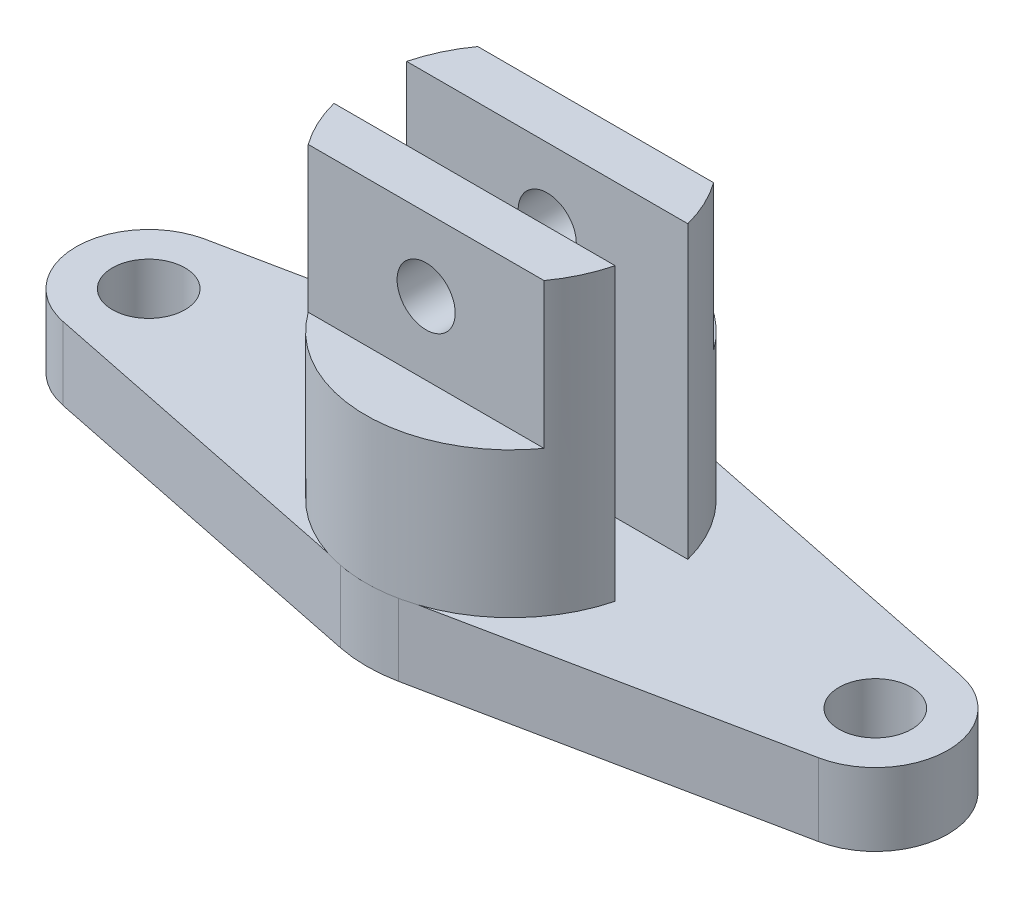
ISO-10303-21;
HEADER;
FILE_DESCRIPTION(('STEP AP214'),'2;1');
FILE_NAME('part.step','',(''),(''),'','','');
FILE_SCHEMA(('AUTOMOTIVE_DESIGN { 1 0 10303 214 1 1 1 1 }'));
ENDSEC;
DATA;
#1=APPLICATION_CONTEXT('core data for automotive mechanical design processes');
#2=APPLICATION_PROTOCOL_DEFINITION('international standard','automotive_design',2000,#1);
#3=PRODUCT_CONTEXT('',#1,'mechanical');
#4=PRODUCT('Part','Part','',(#3));
#5=PRODUCT_RELATED_PRODUCT_CATEGORY('part','',(#4));
#6=PRODUCT_DEFINITION_FORMATION('','',#4);
#7=PRODUCT_DEFINITION_CONTEXT('part definition',#1,'design');
#8=PRODUCT_DEFINITION('design','',#6,#7);
#9=PRODUCT_DEFINITION_SHAPE('','',#8);
#10=(LENGTH_UNIT() NAMED_UNIT(*) SI_UNIT(.MILLI.,.METRE.));
#11=(NAMED_UNIT(*) PLANE_ANGLE_UNIT() SI_UNIT($,.RADIAN.));
#12=(NAMED_UNIT(*) SI_UNIT($,.STERADIAN.) SOLID_ANGLE_UNIT());
#13=UNCERTAINTY_MEASURE_WITH_UNIT(LENGTH_MEASURE(1.E-05),#10,'distance_accuracy_value','');
#14=(GEOMETRIC_REPRESENTATION_CONTEXT(3) GLOBAL_UNCERTAINTY_ASSIGNED_CONTEXT((#13)) GLOBAL_UNIT_ASSIGNED_CONTEXT((#10,
#11,#12)) REPRESENTATION_CONTEXT('',''));
#15=CARTESIAN_POINT('',(0.,0.,0.));
#16=DIRECTION('',(0.,0.,1.));
#17=DIRECTION('',(1.,0.,0.));
#18=AXIS2_PLACEMENT_3D('',#15,#16,#17);
#19=CARTESIAN_POINT('',(-75.,15.,-0.225353750431825));
#20=DIRECTION('',(0.,1.,0.));
#21=DIRECTION('',(0.,0.,1.));
#22=AXIS2_PLACEMENT_3D('',#19,#20,#21);
#23=PLANE('',#22);
#24=CARTESIAN_POINT('',(-75.,15.,-0.225353750431825));
#25=DIRECTION('',(0.,1.,0.));
#26=DIRECTION('',(0.,0.,1.));
#27=AXIS2_PLACEMENT_3D('',#24,#25,#26);
#28=CIRCLE('',#27,7.5);
#29=CARTESIAN_POINT('',(-75.,15.,7.27464624956817));
#30=VERTEX_POINT('',#29);
#31=EDGE_CURVE('E323',#30,#30,#28,.T.);
#32=ORIENTED_EDGE('',*,*,#31,.F.);
#33=EDGE_LOOP('',(#32));
#34=FACE_BOUND('',#33,.T.);
#35=CARTESIAN_POINT('',(75.,15.,-0.225353750431825));
#36=DIRECTION('',(0.,1.,0.));
#37=DIRECTION('',(0.,0.,1.));
#38=AXIS2_PLACEMENT_3D('',#35,#36,#37);
#39=CIRCLE('',#38,7.5);
#40=CARTESIAN_POINT('',(75.,15.,7.27464624956817));
#41=VERTEX_POINT('',#40);
#42=EDGE_CURVE('E330',#41,#41,#39,.T.);
#43=ORIENTED_EDGE('',*,*,#42,.F.);
#44=EDGE_LOOP('',(#43));
#45=FACE_BOUND('',#44,.T.);
#46=DIRECTION('',(1.,0.,0.));
#47=VECTOR('',#46,1.);
#48=CARTESIAN_POINT('',(-29.0232994640735,15.,-7.5));
#49=LINE('',#48,#47);
#50=CARTESIAN_POINT('',(-29.0232994640735,15.,-7.5));
#51=VERTEX_POINT('',#50);
#52=CARTESIAN_POINT('',(29.0232994640735,15.,-7.5));
#53=VERTEX_POINT('',#52);
#54=EDGE_CURVE('E216',#51,#53,#49,.T.);
#55=ORIENTED_EDGE('',*,*,#54,.F.);
#56=CARTESIAN_POINT('',(0.,15.,0.));
#57=DIRECTION('',(0.,1.,0.));
#58=DIRECTION('',(0.,0.,1.));
#59=AXIS2_PLACEMENT_3D('',#56,#57,#58);
#60=CIRCLE('',#59,29.976689473344);
#61=EDGE_CURVE('E203',#53,#51,#60,.T.);
#62=ORIENTED_EDGE('',*,*,#61,.F.);
#63=EDGE_LOOP('',(#55,#62));
#64=FACE_BOUND('',#63,.T.);
#65=DIRECTION('',(0.979795897113271,0.,0.2));
#66=VECTOR('',#65,1.);
#67=CARTESIAN_POINT('',(-78.,15.,14.4715847062672));
#68=LINE('',#67,#66);
#69=CARTESIAN_POINT('',(-78.,15.,14.4715847062672));
#70=VERTEX_POINT('',#69);
#71=CARTESIAN_POINT('',(-9.32172038169414,15.,28.4904798293535));
#72=VERTEX_POINT('',#71);
#73=EDGE_CURVE('E231',#70,#72,#68,.T.);
#74=ORIENTED_EDGE('',*,*,#73,.T.);
#75=CARTESIAN_POINT('',(0.,15.,0.));
#76=DIRECTION('',(0.,1.,0.));
#77=DIRECTION('',(0.,0.,1.));
#78=AXIS2_PLACEMENT_3D('',#75,#76,#77);
#79=CIRCLE('',#78,29.976689473344);
#80=CARTESIAN_POINT('',(-29.0232994640735,15.,7.5));
#81=VERTEX_POINT('',#80);
#82=EDGE_CURVE('E204',#81,#72,#79,.T.);
#83=ORIENTED_EDGE('',*,*,#82,.F.);
#84=DIRECTION('',(-1.,0.,0.));
#85=VECTOR('',#84,1.);
#86=CARTESIAN_POINT('',(-29.0232994640735,15.,7.5));
#87=LINE('',#86,#85);
#88=CARTESIAN_POINT('',(29.0232994640735,15.,7.5));
#89=VERTEX_POINT('',#88);
#90=EDGE_CURVE('E188',#89,#81,#87,.T.);
#91=ORIENTED_EDGE('',*,*,#90,.F.);
#92=CARTESIAN_POINT('',(9.32172038169412,15.,28.4904798293535));
#93=VERTEX_POINT('',#92);
#94=EDGE_CURVE('E194',#93,#89,#79,.T.);
#95=ORIENTED_EDGE('',*,*,#94,.F.);
#96=DIRECTION('',(0.979795897113271,0.,-0.2));
#97=VECTOR('',#96,1.);
#98=CARTESIAN_POINT('',(78.,15.,14.4715847062672));
#99=LINE('',#98,#97);
#100=CARTESIAN_POINT('',(78.,15.,14.4715847062672));
#101=VERTEX_POINT('',#100);
#102=EDGE_CURVE('E240',#93,#101,#99,.T.);
#103=ORIENTED_EDGE('',*,*,#102,.T.);
#104=CARTESIAN_POINT('',(75.,15.,-0.225353750431825));
#105=DIRECTION('',(0.,1.,0.));
#106=DIRECTION('',(0.,0.,-1.));
#107=AXIS2_PLACEMENT_3D('',#104,#105,#106);
#108=CIRCLE('',#107,15.);
#109=CARTESIAN_POINT('',(78.,15.,-14.9222922071309));
#110=VERTEX_POINT('',#109);
#111=EDGE_CURVE('E245',#101,#110,#108,.T.);
#112=ORIENTED_EDGE('',*,*,#111,.T.);
#113=DIRECTION('',(-0.979795897113271,0.,-0.2));
#114=VECTOR('',#113,1.);
#115=CARTESIAN_POINT('',(78.,15.,-14.9222922071309));
#116=LINE('',#115,#114);
#117=CARTESIAN_POINT('',(6.00000000000001,15.,-29.61923066383));
#118=VERTEX_POINT('',#117);
#119=EDGE_CURVE('E248',#110,#118,#116,.T.);
#120=ORIENTED_EDGE('',*,*,#119,.T.);
#121=CARTESIAN_POINT('',(0.,15.,-0.225353750431825));
#122=DIRECTION('',(0.,1.,0.));
#123=DIRECTION('',(0.,0.,1.));
#124=AXIS2_PLACEMENT_3D('',#121,#122,#123);
#125=CIRCLE('',#124,30.);
#126=CARTESIAN_POINT('',(-6.,15.,-29.61923066383));
#127=VERTEX_POINT('',#126);
#128=EDGE_CURVE('E251',#118,#127,#125,.T.);
#129=ORIENTED_EDGE('',*,*,#128,.T.);
#130=DIRECTION('',(-0.979795897113271,0.,0.2));
#131=VECTOR('',#130,1.);
#132=CARTESIAN_POINT('',(-78.,15.,-14.9222922071309));
#133=LINE('',#132,#131);
#134=CARTESIAN_POINT('',(-78.,15.,-14.9222922071309));
#135=VERTEX_POINT('',#134);
#136=EDGE_CURVE('E254',#127,#135,#133,.T.);
#137=ORIENTED_EDGE('',*,*,#136,.T.);
#138=CARTESIAN_POINT('',(-75.,15.,-0.225353750431825));
#139=DIRECTION('',(0.,1.,0.));
#140=DIRECTION('',(0.,0.,1.));
#141=AXIS2_PLACEMENT_3D('',#138,#139,#140);
#142=CIRCLE('',#141,15.);
#143=EDGE_CURVE('E227',#135,#70,#142,.T.);
#144=ORIENTED_EDGE('',*,*,#143,.T.);
#145=EDGE_LOOP('',(#74,#83,#91,#95,#103,#112,#120,#129,#137,#144));
#146=FACE_BOUND('',#145,.T.);
#147=ADVANCED_FACE('F42',(#34,#45,#64,#146),#23,.T.);
#148=CARTESIAN_POINT('',(-75.,15.,-0.225353750431825));
#149=DIRECTION('',(0.,-1.,0.));
#150=DIRECTION('',(0.,0.,-1.));
#151=AXIS2_PLACEMENT_3D('',#148,#149,#150);
#152=CYLINDRICAL_SURFACE('',#151,15.);
#153=CARTESIAN_POINT('',(-75.,0.,-0.225353750431825));
#154=DIRECTION('',(0.,1.,0.));
#155=DIRECTION('',(0.,0.,1.));
#156=AXIS2_PLACEMENT_3D('',#153,#154,#155);
#157=CIRCLE('',#156,15.);
#158=CARTESIAN_POINT('',(-78.,0.,-14.9222922071309));
#159=VERTEX_POINT('',#158);
#160=CARTESIAN_POINT('',(-78.,0.,14.4715847062672));
#161=VERTEX_POINT('',#160);
#162=EDGE_CURVE('E226',#159,#161,#157,.T.);
#163=ORIENTED_EDGE('',*,*,#162,.T.);
#164=DIRECTION('',(0.,-1.,0.));
#165=VECTOR('',#164,1.);
#166=CARTESIAN_POINT('',(-78.,15.,14.4715847062672));
#167=LINE('',#166,#165);
#168=EDGE_CURVE('E172',#70,#161,#167,.T.);
#169=ORIENTED_EDGE('',*,*,#168,.F.);
#170=ORIENTED_EDGE('',*,*,#143,.F.);
#171=DIRECTION('',(0.,-1.,0.));
#172=VECTOR('',#171,1.);
#173=CARTESIAN_POINT('',(-78.,15.,-14.9222922071309));
#174=LINE('',#173,#172);
#175=EDGE_CURVE('E257',#135,#159,#174,.T.);
#176=ORIENTED_EDGE('',*,*,#175,.T.);
#177=EDGE_LOOP('',(#163,#169,#170,#176));
#178=FACE_BOUND('',#177,.T.);
#179=ADVANCED_FACE('F44',(#178),#152,.T.);
#180=CARTESIAN_POINT('',(-78.,15.,14.4715847062672));
#181=DIRECTION('',(0.2,0.,-0.979795897113271));
#182=DIRECTION('',(-0.979795897113271,0.,-0.2));
#183=AXIS2_PLACEMENT_3D('',#180,#181,#182);
#184=PLANE('',#183);
#185=DIRECTION('',(0.979795897113271,0.,0.2));
#186=VECTOR('',#185,1.);
#187=CARTESIAN_POINT('',(-78.,0.,14.4715847062672));
#188=LINE('',#187,#186);
#189=CARTESIAN_POINT('',(-6.00000000000001,0.,29.1685231629663));
#190=VERTEX_POINT('',#189);
#191=EDGE_CURVE('E261',#161,#190,#188,.T.);
#192=ORIENTED_EDGE('',*,*,#191,.T.);
#193=DIRECTION('',(0.,-1.,0.));
#194=VECTOR('',#193,1.);
#195=CARTESIAN_POINT('',(-6.00000000000001,15.,29.1685231629663));
#196=LINE('',#195,#194);
#197=CARTESIAN_POINT('',(-6.00000000000001,15.,29.1685231629663));
#198=VERTEX_POINT('',#197);
#199=EDGE_CURVE('E304',#198,#190,#196,.T.);
#200=ORIENTED_EDGE('',*,*,#199,.F.);
#201=DIRECTION('',(0.979795897113271,0.,0.2));
#202=VECTOR('',#201,1.);
#203=CARTESIAN_POINT('',(-78.,15.,14.4715847062672));
#204=LINE('',#203,#202);
#205=EDGE_CURVE('E199',#72,#198,#204,.T.);
#206=ORIENTED_EDGE('',*,*,#205,.F.);
#207=ORIENTED_EDGE('',*,*,#73,.F.);
#208=ORIENTED_EDGE('',*,*,#168,.T.);
#209=EDGE_LOOP('',(#192,#200,#206,#207,#208));
#210=FACE_BOUND('',#209,.T.);
#211=ADVANCED_FACE('F416',(#210),#184,.F.);
#212=CARTESIAN_POINT('',(0.,15.,-0.225353750431825));
#213=DIRECTION('',(0.,-1.,0.));
#214=DIRECTION('',(0.,0.,-1.));
#215=AXIS2_PLACEMENT_3D('',#212,#213,#214);
#216=CYLINDRICAL_SURFACE('',#215,30.);
#217=CARTESIAN_POINT('',(0.,0.,-0.225353750431825));
#218=DIRECTION('',(0.,1.,0.));
#219=DIRECTION('',(0.,0.,1.));
#220=AXIS2_PLACEMENT_3D('',#217,#218,#219);
#221=CIRCLE('',#220,30.);
#222=CARTESIAN_POINT('',(6.,0.,29.1685231629663));
#223=VERTEX_POINT('',#222);
#224=EDGE_CURVE('E264',#190,#223,#221,.T.);
#225=ORIENTED_EDGE('',*,*,#224,.T.);
#226=DIRECTION('',(0.,-1.,0.));
#227=VECTOR('',#226,1.);
#228=CARTESIAN_POINT('',(6.,15.,29.1685231629663));
#229=LINE('',#228,#227);
#230=CARTESIAN_POINT('',(6.,15.,29.1685231629663));
#231=VERTEX_POINT('',#230);
#232=EDGE_CURVE('E300',#231,#223,#229,.T.);
#233=ORIENTED_EDGE('',*,*,#232,.F.);
#234=CARTESIAN_POINT('',(0.,15.,-0.225353750431825));
#235=DIRECTION('',(0.,1.,0.));
#236=DIRECTION('',(0.,0.,1.));
#237=AXIS2_PLACEMENT_3D('',#234,#235,#236);
#238=CIRCLE('',#237,30.);
#239=EDGE_CURVE('E236',#198,#231,#238,.T.);
#240=ORIENTED_EDGE('',*,*,#239,.F.);
#241=ORIENTED_EDGE('',*,*,#199,.T.);
#242=EDGE_LOOP('',(#225,#233,#240,#241));
#243=FACE_BOUND('',#242,.T.);
#244=ADVANCED_FACE('F444',(#243),#216,.T.);
#245=CARTESIAN_POINT('',(78.,15.,14.4715847062672));
#246=DIRECTION('',(-0.2,0.,-0.979795897113271));
#247=DIRECTION('',(-0.979795897113271,0.,0.2));
#248=AXIS2_PLACEMENT_3D('',#245,#246,#247);
#249=PLANE('',#248);
#250=DIRECTION('',(0.979795897113271,0.,-0.2));
#251=VECTOR('',#250,1.);
#252=CARTESIAN_POINT('',(78.,0.,14.4715847062672));
#253=LINE('',#252,#251);
#254=CARTESIAN_POINT('',(78.,0.,14.4715847062672));
#255=VERTEX_POINT('',#254);
#256=EDGE_CURVE('E267',#223,#255,#253,.T.);
#257=ORIENTED_EDGE('',*,*,#256,.T.);
#258=DIRECTION('',(0.,-1.,0.));
#259=VECTOR('',#258,1.);
#260=CARTESIAN_POINT('',(78.,15.,14.4715847062672));
#261=LINE('',#260,#259);
#262=EDGE_CURVE('E296',#101,#255,#261,.T.);
#263=ORIENTED_EDGE('',*,*,#262,.F.);
#264=ORIENTED_EDGE('',*,*,#102,.F.);
#265=EDGE_CURVE('E241',#231,#93,#99,.T.);
#266=ORIENTED_EDGE('',*,*,#265,.F.);
#267=ORIENTED_EDGE('',*,*,#232,.T.);
#268=EDGE_LOOP('',(#257,#263,#264,#266,#267));
#269=FACE_BOUND('',#268,.T.);
#270=ADVANCED_FACE('F390',(#269),#249,.F.);
#271=CARTESIAN_POINT('',(75.,15.,-0.225353750431825));
#272=DIRECTION('',(0.,-1.,0.));
#273=DIRECTION('',(0.,0.,-1.));
#274=AXIS2_PLACEMENT_3D('',#271,#272,#273);
#275=CYLINDRICAL_SURFACE('',#274,15.);
#276=CARTESIAN_POINT('',(75.,0.,-0.225353750431825));
#277=DIRECTION('',(0.,1.,0.));
#278=DIRECTION('',(0.,0.,-1.));
#279=AXIS2_PLACEMENT_3D('',#276,#277,#278);
#280=CIRCLE('',#279,15.);
#281=CARTESIAN_POINT('',(78.,0.,-14.9222922071309));
#282=VERTEX_POINT('',#281);
#283=EDGE_CURVE('E270',#255,#282,#280,.T.);
#284=ORIENTED_EDGE('',*,*,#283,.T.);
#285=DIRECTION('',(0.,-1.,0.));
#286=VECTOR('',#285,1.);
#287=CARTESIAN_POINT('',(78.,15.,-14.9222922071309));
#288=LINE('',#287,#286);
#289=EDGE_CURVE('E292',#110,#282,#288,.T.);
#290=ORIENTED_EDGE('',*,*,#289,.F.);
#291=ORIENTED_EDGE('',*,*,#111,.F.);
#292=ORIENTED_EDGE('',*,*,#262,.T.);
#293=EDGE_LOOP('',(#284,#290,#291,#292));
#294=FACE_BOUND('',#293,.T.);
#295=ADVANCED_FACE('F437',(#294),#275,.T.);
#296=CARTESIAN_POINT('',(78.,15.,-14.9222922071309));
#297=DIRECTION('',(-0.2,0.,0.979795897113271));
#298=DIRECTION('',(0.979795897113271,0.,0.2));
#299=AXIS2_PLACEMENT_3D('',#296,#297,#298);
#300=PLANE('',#299);
#301=DIRECTION('',(-0.979795897113271,0.,-0.2));
#302=VECTOR('',#301,1.);
#303=CARTESIAN_POINT('',(78.,0.,-14.9222922071309));
#304=LINE('',#303,#302);
#305=CARTESIAN_POINT('',(6.00000000000001,0.,-29.61923066383));
#306=VERTEX_POINT('',#305);
#307=EDGE_CURVE('E273',#282,#306,#304,.T.);
#308=ORIENTED_EDGE('',*,*,#307,.T.);
#309=DIRECTION('',(0.,-1.,0.));
#310=VECTOR('',#309,1.);
#311=CARTESIAN_POINT('',(6.00000000000001,15.,-29.61923066383));
#312=LINE('',#311,#310);
#313=EDGE_CURVE('E288',#118,#306,#312,.T.);
#314=ORIENTED_EDGE('',*,*,#313,.F.);
#315=ORIENTED_EDGE('',*,*,#119,.F.);
#316=ORIENTED_EDGE('',*,*,#289,.T.);
#317=EDGE_LOOP('',(#308,#314,#315,#316));
#318=FACE_BOUND('',#317,.T.);
#319=ADVANCED_FACE('F433',(#318),#300,.F.);
#320=CARTESIAN_POINT('',(0.,15.,-0.225353750431825));
#321=DIRECTION('',(0.,-1.,0.));
#322=DIRECTION('',(0.,0.,-1.));
#323=AXIS2_PLACEMENT_3D('',#320,#321,#322);
#324=CYLINDRICAL_SURFACE('',#323,30.);
#325=CARTESIAN_POINT('',(0.,0.,-0.225353750431825));
#326=DIRECTION('',(0.,1.,0.));
#327=DIRECTION('',(0.,0.,1.));
#328=AXIS2_PLACEMENT_3D('',#325,#326,#327);
#329=CIRCLE('',#328,30.);
#330=CARTESIAN_POINT('',(-6.,0.,-29.61923066383));
#331=VERTEX_POINT('',#330);
#332=EDGE_CURVE('E276',#306,#331,#329,.T.);
#333=ORIENTED_EDGE('',*,*,#332,.T.);
#334=DIRECTION('',(0.,-1.,0.));
#335=VECTOR('',#334,1.);
#336=CARTESIAN_POINT('',(-6.,15.,-29.61923066383));
#337=LINE('',#336,#335);
#338=EDGE_CURVE('E284',#127,#331,#337,.T.);
#339=ORIENTED_EDGE('',*,*,#338,.F.);
#340=ORIENTED_EDGE('',*,*,#128,.F.);
#341=ORIENTED_EDGE('',*,*,#313,.T.);
#342=EDGE_LOOP('',(#333,#339,#340,#341));
#343=FACE_BOUND('',#342,.T.);
#344=ADVANCED_FACE('F429',(#343),#324,.T.);
#345=CARTESIAN_POINT('',(-78.,15.,-14.9222922071309));
#346=DIRECTION('',(0.2,0.,0.979795897113271));
#347=DIRECTION('',(0.979795897113271,0.,-0.2));
#348=AXIS2_PLACEMENT_3D('',#345,#346,#347);
#349=PLANE('',#348);
#350=DIRECTION('',(-0.979795897113271,0.,0.2));
#351=VECTOR('',#350,1.);
#352=CARTESIAN_POINT('',(-78.,0.,-14.9222922071309));
#353=LINE('',#352,#351);
#354=EDGE_CURVE('E232',#331,#159,#353,.T.);
#355=ORIENTED_EDGE('',*,*,#354,.T.);
#356=ORIENTED_EDGE('',*,*,#175,.F.);
#357=ORIENTED_EDGE('',*,*,#136,.F.);
#358=ORIENTED_EDGE('',*,*,#338,.T.);
#359=EDGE_LOOP('',(#355,#356,#357,#358));
#360=FACE_BOUND('',#359,.T.);
#361=ADVANCED_FACE('F425',(#360),#349,.F.);
#362=CARTESIAN_POINT('',(-75.,0.,-0.225353750431825));
#363=DIRECTION('',(0.,1.,0.));
#364=DIRECTION('',(0.,0.,1.));
#365=AXIS2_PLACEMENT_3D('',#362,#363,#364);
#366=PLANE('',#365);
#367=CARTESIAN_POINT('',(-75.,0.,-0.225353750431825));
#368=DIRECTION('',(0.,1.,0.));
#369=DIRECTION('',(0.,0.,1.));
#370=AXIS2_PLACEMENT_3D('',#367,#368,#369);
#371=CIRCLE('',#370,7.5);
#372=CARTESIAN_POINT('',(-75.,0.,7.27464624956817));
#373=VERTEX_POINT('',#372);
#374=EDGE_CURVE('E46',#373,#373,#371,.T.);
#375=ORIENTED_EDGE('',*,*,#374,.T.);
#376=EDGE_LOOP('',(#375));
#377=FACE_BOUND('',#376,.T.);
#378=CARTESIAN_POINT('',(75.,0.,-0.225353750431825));
#379=DIRECTION('',(0.,1.,0.));
#380=DIRECTION('',(0.,0.,1.));
#381=AXIS2_PLACEMENT_3D('',#378,#379,#380);
#382=CIRCLE('',#381,7.5);
#383=CARTESIAN_POINT('',(75.,0.,7.27464624956817));
#384=VERTEX_POINT('',#383);
#385=EDGE_CURVE('E320',#384,#384,#382,.T.);
#386=ORIENTED_EDGE('',*,*,#385,.T.);
#387=EDGE_LOOP('',(#386));
#388=FACE_BOUND('',#387,.T.);
#389=ORIENTED_EDGE('',*,*,#162,.F.);
#390=ORIENTED_EDGE('',*,*,#354,.F.);
#391=ORIENTED_EDGE('',*,*,#332,.F.);
#392=ORIENTED_EDGE('',*,*,#307,.F.);
#393=ORIENTED_EDGE('',*,*,#283,.F.);
#394=ORIENTED_EDGE('',*,*,#256,.F.);
#395=ORIENTED_EDGE('',*,*,#224,.F.);
#396=ORIENTED_EDGE('',*,*,#191,.F.);
#397=EDGE_LOOP('',(#389,#390,#391,#392,#393,#394,#395,#396));
#398=FACE_BOUND('',#397,.T.);
#399=ADVANCED_FACE('F422',(#377,#388,#398),#366,.F.);
#400=CARTESIAN_POINT('',(0.,75.,0.));
#401=DIRECTION('',(0.,-1.,0.));
#402=DIRECTION('',(0.,0.,-1.));
#403=AXIS2_PLACEMENT_3D('',#400,#401,#402);
#404=CYLINDRICAL_SURFACE('',#403,29.976689473344);
#405=CARTESIAN_POINT('',(0.,75.,0.));
#406=DIRECTION('',(0.,1.,0.));
#407=DIRECTION('',(0.,0.,1.));
#408=AXIS2_PLACEMENT_3D('',#405,#406,#407);
#409=CIRCLE('',#408,29.976689473344);
#410=CARTESIAN_POINT('',(-24.338280789351,75.,-17.5));
#411=VERTEX_POINT('',#410);
#412=CARTESIAN_POINT('',(-29.0232994640735,75.,-7.5));
#413=VERTEX_POINT('',#412);
#414=EDGE_CURVE('E210',#411,#413,#409,.T.);
#415=ORIENTED_EDGE('',*,*,#414,.F.);
#416=DIRECTION('',(0.,-1.,0.));
#417=VECTOR('',#416,1.);
#418=CARTESIAN_POINT('',(-24.338280789351,75.,-17.5));
#419=LINE('',#418,#417);
#420=CARTESIAN_POINT('',(-24.338280789351,45.,-17.5));
#421=VERTEX_POINT('',#420);
#422=EDGE_CURVE('E60',#411,#421,#419,.T.);
#423=ORIENTED_EDGE('',*,*,#422,.T.);
#424=CARTESIAN_POINT('',(0.,45.,0.));
#425=DIRECTION('',(0.,1.,0.));
#426=DIRECTION('',(0.,0.,1.));
#427=AXIS2_PLACEMENT_3D('',#424,#425,#426);
#428=CIRCLE('',#427,29.976689473344);
#429=CARTESIAN_POINT('',(24.338280789351,45.,-17.5));
#430=VERTEX_POINT('',#429);
#431=EDGE_CURVE('E11',#430,#421,#428,.T.);
#432=ORIENTED_EDGE('',*,*,#431,.F.);
#433=DIRECTION('',(0.,-1.,0.));
#434=VECTOR('',#433,1.);
#435=CARTESIAN_POINT('',(24.338280789351,75.,-17.5));
#436=LINE('',#435,#434);
#437=CARTESIAN_POINT('',(24.338280789351,75.,-17.5));
#438=VERTEX_POINT('',#437);
#439=EDGE_CURVE('E356',#430,#438,#436,.F.);
#440=ORIENTED_EDGE('',*,*,#439,.T.);
#441=CARTESIAN_POINT('',(29.0232994640735,75.,-7.5));
#442=VERTEX_POINT('',#441);
#443=EDGE_CURVE('E205',#442,#438,#409,.T.);
#444=ORIENTED_EDGE('',*,*,#443,.F.);
#445=DIRECTION('',(0.,-1.,0.));
#446=VECTOR('',#445,1.);
#447=CARTESIAN_POINT('',(29.0232994640735,75.,-7.5));
#448=LINE('',#447,#446);
#449=EDGE_CURVE('E213',#442,#53,#448,.T.);
#450=ORIENTED_EDGE('',*,*,#449,.T.);
#451=ORIENTED_EDGE('',*,*,#61,.T.);
#452=DIRECTION('',(0.,-1.,0.));
#453=VECTOR('',#452,1.);
#454=CARTESIAN_POINT('',(-29.0232994640735,75.,-7.5));
#455=LINE('',#454,#453);
#456=EDGE_CURVE('E222',#413,#51,#455,.T.);
#457=ORIENTED_EDGE('',*,*,#456,.F.);
#458=EDGE_LOOP('',(#415,#423,#432,#440,#444,#450,#451,#457));
#459=FACE_BOUND('',#458,.T.);
#460=ADVANCED_FACE('F407',(#459),#404,.T.);
#461=CARTESIAN_POINT('',(-29.0232994640735,75.,-7.5));
#462=DIRECTION('',(0.,0.,-1.));
#463=DIRECTION('',(-1.,0.,0.));
#464=AXIS2_PLACEMENT_3D('',#461,#462,#463);
#465=PLANE('',#464);
#466=CARTESIAN_POINT('',(0.,60.,-7.5));
#467=DIRECTION('',(0.,0.,-1.));
#468=DIRECTION('',(-1.,0.,0.));
#469=AXIS2_PLACEMENT_3D('',#466,#467,#468);
#470=CIRCLE('',#469,6.);
#471=CARTESIAN_POINT('',(5.99999999999999,60.,-7.49999999999999));
#472=VERTEX_POINT('',#471);
#473=EDGE_CURVE('E344',#472,#472,#470,.T.);
#474=ORIENTED_EDGE('',*,*,#473,.T.);
#475=EDGE_LOOP('',(#474));
#476=FACE_BOUND('',#475,.T.);
#477=ORIENTED_EDGE('',*,*,#54,.T.);
#478=ORIENTED_EDGE('',*,*,#449,.F.);
#479=DIRECTION('',(1.,0.,0.));
#480=VECTOR('',#479,1.);
#481=CARTESIAN_POINT('',(-29.0232994640735,75.,-7.5));
#482=LINE('',#481,#480);
#483=EDGE_CURVE('E209',#413,#442,#482,.T.);
#484=ORIENTED_EDGE('',*,*,#483,.F.);
#485=ORIENTED_EDGE('',*,*,#456,.T.);
#486=EDGE_LOOP('',(#477,#478,#484,#485));
#487=FACE_BOUND('',#486,.T.);
#488=ADVANCED_FACE('F404',(#476,#487),#465,.F.);
#489=CARTESIAN_POINT('',(0.,75.,0.));
#490=DIRECTION('',(0.,1.,0.));
#491=DIRECTION('',(0.,0.,1.));
#492=AXIS2_PLACEMENT_3D('',#489,#490,#491);
#493=PLANE('',#492);
#494=DIRECTION('',(1.,0.,0.));
#495=VECTOR('',#494,1.);
#496=CARTESIAN_POINT('',(0.,75.,-17.5));
#497=LINE('',#496,#495);
#498=EDGE_CURVE('E52',#411,#438,#497,.T.);
#499=ORIENTED_EDGE('',*,*,#498,.F.);
#500=ORIENTED_EDGE('',*,*,#414,.T.);
#501=ORIENTED_EDGE('',*,*,#483,.T.);
#502=ORIENTED_EDGE('',*,*,#443,.T.);
#503=EDGE_LOOP('',(#499,#500,#501,#502));
#504=FACE_BOUND('',#503,.T.);
#505=ADVANCED_FACE('F399',(#504),#493,.T.);
#506=CARTESIAN_POINT('',(0.,15.,0.));
#507=DIRECTION('',(0.,1.,0.));
#508=DIRECTION('',(0.,0.,1.));
#509=AXIS2_PLACEMENT_3D('',#506,#507,#508);
#510=PLANE('',#509);
#511=EDGE_CURVE('E370',#72,#93,#79,.T.);
#512=ORIENTED_EDGE('',*,*,#511,.F.);
#513=ORIENTED_EDGE('',*,*,#205,.T.);
#514=ORIENTED_EDGE('',*,*,#239,.T.);
#515=ORIENTED_EDGE('',*,*,#265,.T.);
#516=EDGE_LOOP('',(#512,#513,#514,#515));
#517=FACE_BOUND('',#516,.T.);
#518=ADVANCED_FACE('F386',(#517),#510,.F.);
#519=CARTESIAN_POINT('',(0.,75.,0.));
#520=DIRECTION('',(0.,-1.,0.));
#521=DIRECTION('',(0.,0.,-1.));
#522=AXIS2_PLACEMENT_3D('',#519,#520,#521);
#523=CYLINDRICAL_SURFACE('',#522,29.976689473344);
#524=CARTESIAN_POINT('',(0.,75.,0.));
#525=DIRECTION('',(0.,1.,0.));
#526=DIRECTION('',(0.,0.,1.));
#527=AXIS2_PLACEMENT_3D('',#524,#525,#526);
#528=CIRCLE('',#527,29.976689473344);
#529=CARTESIAN_POINT('',(24.338280789351,75.,17.5));
#530=VERTEX_POINT('',#529);
#531=CARTESIAN_POINT('',(29.0232994640735,75.,7.5));
#532=VERTEX_POINT('',#531);
#533=EDGE_CURVE('E189',#530,#532,#528,.T.);
#534=ORIENTED_EDGE('',*,*,#533,.F.);
#535=DIRECTION('',(0.,-1.,0.));
#536=VECTOR('',#535,1.);
#537=CARTESIAN_POINT('',(24.338280789351,75.,17.5));
#538=LINE('',#537,#536);
#539=CARTESIAN_POINT('',(24.338280789351,45.,17.5));
#540=VERTEX_POINT('',#539);
#541=EDGE_CURVE('E68',#530,#540,#538,.T.);
#542=ORIENTED_EDGE('',*,*,#541,.T.);
#543=CARTESIAN_POINT('',(0.,45.,0.));
#544=DIRECTION('',(0.,1.,0.));
#545=DIRECTION('',(0.,0.,1.));
#546=AXIS2_PLACEMENT_3D('',#543,#544,#545);
#547=CIRCLE('',#546,29.976689473344);
#548=CARTESIAN_POINT('',(-24.338280789351,45.,17.5));
#549=VERTEX_POINT('',#548);
#550=EDGE_CURVE('E171',#549,#540,#547,.T.);
#551=ORIENTED_EDGE('',*,*,#550,.F.);
#552=DIRECTION('',(0.,-1.,0.));
#553=VECTOR('',#552,1.);
#554=CARTESIAN_POINT('',(-24.338280789351,75.,17.5));
#555=LINE('',#554,#553);
#556=CARTESIAN_POINT('',(-24.338280789351,75.,17.5));
#557=VERTEX_POINT('',#556);
#558=EDGE_CURVE('E165',#549,#557,#555,.F.);
#559=ORIENTED_EDGE('',*,*,#558,.T.);
#560=CARTESIAN_POINT('',(-29.0232994640735,75.,7.5));
#561=VERTEX_POINT('',#560);
#562=EDGE_CURVE('E179',#561,#557,#528,.T.);
#563=ORIENTED_EDGE('',*,*,#562,.F.);
#564=DIRECTION('',(0.,-1.,0.));
#565=VECTOR('',#564,1.);
#566=CARTESIAN_POINT('',(-29.0232994640735,75.,7.5));
#567=LINE('',#566,#565);
#568=EDGE_CURVE('E366',#561,#81,#567,.T.);
#569=ORIENTED_EDGE('',*,*,#568,.T.);
#570=ORIENTED_EDGE('',*,*,#82,.T.);
#571=ORIENTED_EDGE('',*,*,#511,.T.);
#572=ORIENTED_EDGE('',*,*,#94,.T.);
#573=DIRECTION('',(0.,-1.,0.));
#574=VECTOR('',#573,1.);
#575=CARTESIAN_POINT('',(29.0232994640735,75.,7.5));
#576=LINE('',#575,#574);
#577=EDGE_CURVE('E362',#532,#89,#576,.T.);
#578=ORIENTED_EDGE('',*,*,#577,.F.);
#579=EDGE_LOOP('',(#534,#542,#551,#559,#563,#569,#570,#571,#572,#578));
#580=FACE_BOUND('',#579,.T.);
#581=ADVANCED_FACE('F177',(#580),#523,.T.);
#582=CARTESIAN_POINT('',(-29.0232994640735,75.,7.5));
#583=DIRECTION('',(0.,0.,1.));
#584=DIRECTION('',(1.,0.,0.));
#585=AXIS2_PLACEMENT_3D('',#582,#583,#584);
#586=PLANE('',#585);
#587=CARTESIAN_POINT('',(0.,60.,7.5));
#588=DIRECTION('',(0.,0.,1.));
#589=DIRECTION('',(1.,0.,0.));
#590=AXIS2_PLACEMENT_3D('',#587,#588,#589);
#591=CIRCLE('',#590,6.);
#592=CARTESIAN_POINT('',(5.99999999999999,60.,7.5));
#593=VERTEX_POINT('',#592);
#594=EDGE_CURVE('E318',#593,#593,#591,.T.);
#595=ORIENTED_EDGE('',*,*,#594,.T.);
#596=EDGE_LOOP('',(#595));
#597=FACE_BOUND('',#596,.T.);
#598=ORIENTED_EDGE('',*,*,#90,.T.);
#599=ORIENTED_EDGE('',*,*,#568,.F.);
#600=DIRECTION('',(-1.,0.,0.));
#601=VECTOR('',#600,1.);
#602=CARTESIAN_POINT('',(-29.0232994640735,75.,7.5));
#603=LINE('',#602,#601);
#604=EDGE_CURVE('E185',#532,#561,#603,.T.);
#605=ORIENTED_EDGE('',*,*,#604,.F.);
#606=ORIENTED_EDGE('',*,*,#577,.T.);
#607=EDGE_LOOP('',(#598,#599,#605,#606));
#608=FACE_BOUND('',#607,.T.);
#609=ADVANCED_FACE('F380',(#597,#608),#586,.F.);
#610=CARTESIAN_POINT('',(0.,75.,0.));
#611=DIRECTION('',(0.,1.,0.));
#612=DIRECTION('',(0.,0.,1.));
#613=AXIS2_PLACEMENT_3D('',#610,#611,#612);
#614=PLANE('',#613);
#615=DIRECTION('',(-1.,0.,0.));
#616=VECTOR('',#615,1.);
#617=CARTESIAN_POINT('',(0.,75.,17.5));
#618=LINE('',#617,#616);
#619=EDGE_CURVE('E162',#530,#557,#618,.T.);
#620=ORIENTED_EDGE('',*,*,#619,.F.);
#621=ORIENTED_EDGE('',*,*,#533,.T.);
#622=ORIENTED_EDGE('',*,*,#604,.T.);
#623=ORIENTED_EDGE('',*,*,#562,.T.);
#624=EDGE_LOOP('',(#620,#621,#622,#623));
#625=FACE_BOUND('',#624,.T.);
#626=ADVANCED_FACE('F183',(#625),#614,.T.);
#627=CARTESIAN_POINT('',(0.,45.,0.));
#628=DIRECTION('',(0.,1.,0.));
#629=DIRECTION('',(0.,0.,1.));
#630=AXIS2_PLACEMENT_3D('',#627,#628,#629);
#631=PLANE('',#630);
#632=ORIENTED_EDGE('',*,*,#550,.T.);
#633=DIRECTION('',(-1.,0.,0.));
#634=VECTOR('',#633,1.);
#635=CARTESIAN_POINT('',(-24.3669858620224,45.,17.5));
#636=LINE('',#635,#634);
#637=EDGE_CURVE('E181',#540,#549,#636,.T.);
#638=ORIENTED_EDGE('',*,*,#637,.T.);
#639=EDGE_LOOP('',(#632,#638));
#640=FACE_BOUND('',#639,.T.);
#641=ADVANCED_FACE('F539',(#640),#631,.T.);
#642=CARTESIAN_POINT('',(-24.3669858620224,45.,17.5));
#643=DIRECTION('',(0.,0.,-1.));
#644=DIRECTION('',(-1.,0.,0.));
#645=AXIS2_PLACEMENT_3D('',#642,#643,#644);
#646=PLANE('',#645);
#647=CARTESIAN_POINT('',(0.,60.,17.5));
#648=DIRECTION('',(0.,0.,1.));
#649=DIRECTION('',(1.,0.,0.));
#650=AXIS2_PLACEMENT_3D('',#647,#648,#649);
#651=CIRCLE('',#650,6.);
#652=CARTESIAN_POINT('',(5.99999999999999,60.,17.5));
#653=VERTEX_POINT('',#652);
#654=EDGE_CURVE('E319',#653,#653,#651,.T.);
#655=ORIENTED_EDGE('',*,*,#654,.F.);
#656=EDGE_LOOP('',(#655));
#657=FACE_BOUND('',#656,.T.);
#658=ORIENTED_EDGE('',*,*,#619,.T.);
#659=ORIENTED_EDGE('',*,*,#558,.F.);
#660=ORIENTED_EDGE('',*,*,#637,.F.);
#661=ORIENTED_EDGE('',*,*,#541,.F.);
#662=EDGE_LOOP('',(#658,#659,#660,#661));
#663=FACE_BOUND('',#662,.T.);
#664=ADVANCED_FACE('F164',(#657,#663),#646,.F.);
#665=CARTESIAN_POINT('',(0.,45.,0.));
#666=DIRECTION('',(0.,1.,0.));
#667=DIRECTION('',(0.,0.,1.));
#668=AXIS2_PLACEMENT_3D('',#665,#666,#667);
#669=PLANE('',#668);
#670=ORIENTED_EDGE('',*,*,#431,.T.);
#671=DIRECTION('',(1.,0.,0.));
#672=VECTOR('',#671,1.);
#673=CARTESIAN_POINT('',(-24.3669858620224,45.,-17.5));
#674=LINE('',#673,#672);
#675=EDGE_CURVE('E348',#421,#430,#674,.T.);
#676=ORIENTED_EDGE('',*,*,#675,.T.);
#677=EDGE_LOOP('',(#670,#676));
#678=FACE_BOUND('',#677,.T.);
#679=ADVANCED_FACE('F552',(#678),#669,.T.);
#680=CARTESIAN_POINT('',(-24.3669858620224,45.,-17.5));
#681=DIRECTION('',(0.,0.,1.));
#682=DIRECTION('',(1.,0.,0.));
#683=AXIS2_PLACEMENT_3D('',#680,#681,#682);
#684=PLANE('',#683);
#685=CARTESIAN_POINT('',(0.,60.,-17.5));
#686=DIRECTION('',(0.,0.,1.));
#687=DIRECTION('',(1.,0.,0.));
#688=AXIS2_PLACEMENT_3D('',#685,#686,#687);
#689=CIRCLE('',#688,6.);
#690=CARTESIAN_POINT('',(5.99999999999999,60.,-17.5));
#691=VERTEX_POINT('',#690);
#692=EDGE_CURVE('E315',#691,#691,#689,.T.);
#693=ORIENTED_EDGE('',*,*,#692,.T.);
#694=EDGE_LOOP('',(#693));
#695=FACE_BOUND('',#694,.T.);
#696=ORIENTED_EDGE('',*,*,#498,.T.);
#697=ORIENTED_EDGE('',*,*,#439,.F.);
#698=ORIENTED_EDGE('',*,*,#675,.F.);
#699=ORIENTED_EDGE('',*,*,#422,.F.);
#700=EDGE_LOOP('',(#696,#697,#698,#699));
#701=FACE_BOUND('',#700,.T.);
#702=ADVANCED_FACE('F560',(#695,#701),#684,.F.);
#703=CARTESIAN_POINT('',(0.,60.,-46.5));
#704=DIRECTION('',(0.,0.,1.));
#705=DIRECTION('',(1.,0.,0.));
#706=AXIS2_PLACEMENT_3D('',#703,#704,#705);
#707=CYLINDRICAL_SURFACE('',#706,6.);
#708=CARTESIAN_POINT('',(5.99999999999999,60.,-17.5));
#709=CARTESIAN_POINT('',(5.99999999999999,60.,-17.3958333333333));
#710=CARTESIAN_POINT('',(5.99999999999999,60.,-17.2916666666667));
#711=CARTESIAN_POINT('',(5.99999999999999,60.,-17.0833333333333));
#712=CARTESIAN_POINT('',(5.99999999999999,60.,-16.9791666666667));
#713=CARTESIAN_POINT('',(5.99999999999999,60.,-16.7708333333333));
#714=CARTESIAN_POINT('',(5.99999999999999,60.,-16.6666666666667));
#715=CARTESIAN_POINT('',(5.99999999999999,60.,-16.4583333333333));
#716=CARTESIAN_POINT('',(5.99999999999999,60.,-16.3541666666667));
#717=CARTESIAN_POINT('',(5.99999999999999,60.,-16.1458333333333));
#718=CARTESIAN_POINT('',(5.99999999999999,60.,-16.0416666666667));
#719=CARTESIAN_POINT('',(5.99999999999999,60.,-15.8333333333333));
#720=CARTESIAN_POINT('',(5.99999999999999,60.,-15.7291666666667));
#721=CARTESIAN_POINT('',(5.99999999999999,60.,-15.5208333333333));
#722=CARTESIAN_POINT('',(5.99999999999999,60.,-15.4166666666667));
#723=CARTESIAN_POINT('',(5.99999999999999,60.,-15.2083333333333));
#724=CARTESIAN_POINT('',(5.99999999999999,60.,-15.1041666666667));
#725=CARTESIAN_POINT('',(5.99999999999999,60.,-14.8958333333333));
#726=CARTESIAN_POINT('',(5.99999999999999,60.,-14.7916666666667));
#727=CARTESIAN_POINT('',(5.99999999999999,60.,-14.5833333333333));
#728=CARTESIAN_POINT('',(5.99999999999999,60.,-14.4791666666667));
#729=CARTESIAN_POINT('',(5.99999999999999,60.,-14.2708333333333));
#730=CARTESIAN_POINT('',(5.99999999999999,60.,-14.1666666666667));
#731=CARTESIAN_POINT('',(5.99999999999999,60.,-13.9583333333333));
#732=CARTESIAN_POINT('',(5.99999999999999,60.,-13.8541666666667));
#733=CARTESIAN_POINT('',(5.99999999999999,60.,-13.6458333333333));
#734=CARTESIAN_POINT('',(5.99999999999999,60.,-13.5416666666667));
#735=CARTESIAN_POINT('',(5.99999999999999,60.,-13.3333333333333));
#736=CARTESIAN_POINT('',(5.99999999999999,60.,-13.2291666666667));
#737=CARTESIAN_POINT('',(5.99999999999999,60.,-13.0208333333333));
#738=CARTESIAN_POINT('',(5.99999999999999,60.,-12.9166666666667));
#739=CARTESIAN_POINT('',(5.99999999999999,60.,-12.7083333333333));
#740=CARTESIAN_POINT('',(5.99999999999999,60.,-12.6041666666667));
#741=CARTESIAN_POINT('',(5.99999999999999,60.,-12.3958333333333));
#742=CARTESIAN_POINT('',(5.99999999999999,60.,-12.2916666666667));
#743=CARTESIAN_POINT('',(5.99999999999999,60.,-12.0833333333333));
#744=CARTESIAN_POINT('',(5.99999999999999,60.,-11.9791666666667));
#745=CARTESIAN_POINT('',(5.99999999999999,60.,-11.7708333333333));
#746=CARTESIAN_POINT('',(5.99999999999999,60.,-11.6666666666667));
#747=CARTESIAN_POINT('',(5.99999999999999,60.,-11.4583333333333));
#748=CARTESIAN_POINT('',(5.99999999999999,60.,-11.3541666666667));
#749=CARTESIAN_POINT('',(5.99999999999999,60.,-11.1458333333333));
#750=CARTESIAN_POINT('',(5.99999999999999,60.,-11.0416666666667));
#751=CARTESIAN_POINT('',(5.99999999999999,60.,-10.8333333333333));
#752=CARTESIAN_POINT('',(5.99999999999999,60.,-10.7291666666667));
#753=CARTESIAN_POINT('',(5.99999999999999,60.,-10.5208333333333));
#754=CARTESIAN_POINT('',(5.99999999999999,60.,-10.4166666666667));
#755=CARTESIAN_POINT('',(5.99999999999999,60.,-10.2083333333333));
#756=CARTESIAN_POINT('',(5.99999999999999,60.,-10.1041666666667));
#757=CARTESIAN_POINT('',(5.99999999999999,60.,-9.89583333333333));
#758=CARTESIAN_POINT('',(5.99999999999999,60.,-9.79166666666666));
#759=CARTESIAN_POINT('',(5.99999999999999,60.,-9.58333333333333));
#760=CARTESIAN_POINT('',(5.99999999999999,60.,-9.47916666666666));
#761=CARTESIAN_POINT('',(5.99999999999999,60.,-9.27083333333333));
#762=CARTESIAN_POINT('',(5.99999999999999,60.,-9.16666666666666));
#763=CARTESIAN_POINT('',(5.99999999999999,60.,-8.95833333333333));
#764=CARTESIAN_POINT('',(5.99999999999999,60.,-8.85416666666666));
#765=CARTESIAN_POINT('',(5.99999999999999,60.,-8.64583333333333));
#766=CARTESIAN_POINT('',(5.99999999999999,60.,-8.54166666666666));
#767=CARTESIAN_POINT('',(5.99999999999999,60.,-8.33333333333333));
#768=CARTESIAN_POINT('',(5.99999999999999,60.,-8.22916666666666));
#769=CARTESIAN_POINT('',(5.99999999999999,60.,-8.02083333333333));
#770=CARTESIAN_POINT('',(5.99999999999999,60.,-7.91666666666666));
#771=CARTESIAN_POINT('',(5.99999999999999,60.,-7.70833333333333));
#772=CARTESIAN_POINT('',(5.99999999999999,60.,-7.60416666666666));
#773=CARTESIAN_POINT('',(5.99999999999999,60.,-7.49999999999999));
#774=B_SPLINE_CURVE_WITH_KNOTS('',3,(#708,#709,#710,#711,#712,#713,#714,#715,#716,#717,#718,
#719,#720,#721,#722,#723,#724,#725,#726,#727,#728,#729,#730,#731,#732,#733,#734,#735,#736,#737,
#738,#739,#740,#741,#742,#743,#744,#745,#746,#747,#748,#749,#750,#751,#752,#753,#754,#755,#756,
#757,#758,#759,#760,#761,#762,#763,#764,#765,#766,#767,#768,#769,#770,#771,#772,#773),
.UNSPECIFIED.,.F.,.F.,(4,2,2,2,2,2,2,2,2,2,2,2,2,2,2,2,2,2,2,2,2,2,2,2,2,2,2,2,2,2,2,2,4),(0.,
0.3125,0.625000000000001,0.937500000000001,1.25,1.5625,1.875,2.1875,2.5,2.8125,3.125,3.4375,
3.75,4.0625,4.375,4.6875,5.,5.3125,5.62500000000001,5.93750000000001,6.25000000000001,
6.56250000000001,6.87500000000001,7.18750000000001,7.50000000000001,7.81250000000001,
8.12500000000001,8.43750000000001,8.75000000000001,9.06250000000001,9.37500000000001,
9.68750000000001,10.),.UNSPECIFIED.);
#775=EDGE_CURVE('BSEAM567',#691,#472,#774,.T.);
#776=ORIENTED_EDGE('',*,*,#692,.F.);
#777=ORIENTED_EDGE('',*,*,#473,.F.);
#778=ORIENTED_EDGE('',*,*,#775,.T.);
#779=ORIENTED_EDGE('',*,*,#775,.F.);
#780=EDGE_LOOP('',(#776,#778,#777,#779));
#781=FACE_BOUND('',#780,.T.);
#782=ADVANCED_FACE('F567',(#781),#707,.F.);
#783=ORIENTED_EDGE('',*,*,#654,.T.);
#784=EDGE_LOOP('',(#783));
#785=FACE_BOUND('',#784,.T.);
#786=ORIENTED_EDGE('',*,*,#594,.F.);
#787=EDGE_LOOP('',(#786));
#788=FACE_BOUND('',#787,.T.);
#789=ADVANCED_FACE('F575',(#785,#788),#707,.F.);
#790=CARTESIAN_POINT('',(75.,-49.,-0.225353750431825));
#791=DIRECTION('',(0.,1.,0.));
#792=DIRECTION('',(0.,0.,1.));
#793=AXIS2_PLACEMENT_3D('',#790,#791,#792);
#794=CYLINDRICAL_SURFACE('',#793,7.5);
#795=ORIENTED_EDGE('',*,*,#42,.T.);
#796=EDGE_LOOP('',(#795));
#797=FACE_BOUND('',#796,.T.);
#798=ORIENTED_EDGE('',*,*,#385,.F.);
#799=EDGE_LOOP('',(#798));
#800=FACE_BOUND('',#799,.T.);
#801=ADVANCED_FACE('F583',(#797,#800),#794,.F.);
#802=CARTESIAN_POINT('',(-75.,-49.,-0.225353750431825));
#803=DIRECTION('',(0.,1.,0.));
#804=DIRECTION('',(0.,0.,1.));
#805=AXIS2_PLACEMENT_3D('',#802,#803,#804);
#806=CYLINDRICAL_SURFACE('',#805,7.5);
#807=ORIENTED_EDGE('',*,*,#31,.T.);
#808=EDGE_LOOP('',(#807));
#809=FACE_BOUND('',#808,.T.);
#810=ORIENTED_EDGE('',*,*,#374,.F.);
#811=EDGE_LOOP('',(#810));
#812=FACE_BOUND('',#811,.T.);
#813=ADVANCED_FACE('F589',(#809,#812),#806,.F.);
#814=CLOSED_SHELL('',(#147,#179,#211,#244,#270,#295,#319,#344,#361,#399,#460,#488,#505,#518,
#581,#609,#626,#641,#664,#679,#702,#782,#789,#801,#813));
#815=MANIFOLD_SOLID_BREP('B2',#814);
#816=ADVANCED_BREP_SHAPE_REPRESENTATION('',(#18,#815),#14);
#817=SHAPE_DEFINITION_REPRESENTATION(#9,#816);
ENDSEC;
END-ISO-10303-21;
